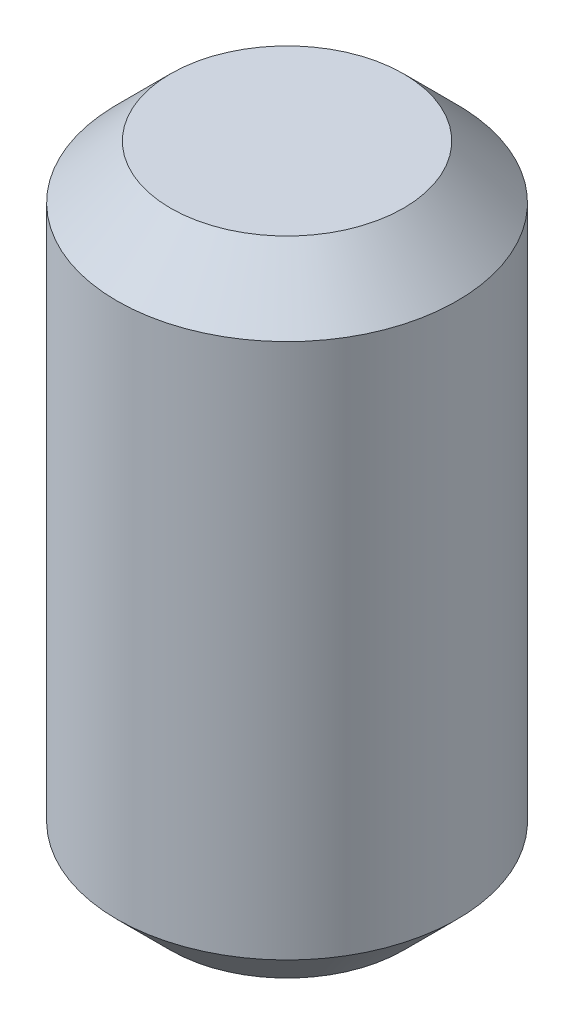
ISO-10303-21;
HEADER;
FILE_DESCRIPTION(('STEP AP214'),'2;1');
FILE_NAME('part.step','',(''),(''),'','','');
FILE_SCHEMA(('AUTOMOTIVE_DESIGN { 1 0 10303 214 1 1 1 1 }'));
ENDSEC;
DATA;
#1=APPLICATION_CONTEXT('core data for automotive mechanical design processes');
#2=APPLICATION_PROTOCOL_DEFINITION('international standard','automotive_design',2000,#1);
#3=PRODUCT_CONTEXT('',#1,'mechanical');
#4=PRODUCT('Part','Part','',(#3));
#5=PRODUCT_RELATED_PRODUCT_CATEGORY('part','',(#4));
#6=PRODUCT_DEFINITION_FORMATION('','',#4);
#7=PRODUCT_DEFINITION_CONTEXT('part definition',#1,'design');
#8=PRODUCT_DEFINITION('design','',#6,#7);
#9=PRODUCT_DEFINITION_SHAPE('','',#8);
#10=(LENGTH_UNIT() NAMED_UNIT(*) SI_UNIT(.MILLI.,.METRE.));
#11=(NAMED_UNIT(*) PLANE_ANGLE_UNIT() SI_UNIT($,.RADIAN.));
#12=(NAMED_UNIT(*) SI_UNIT($,.STERADIAN.) SOLID_ANGLE_UNIT());
#13=UNCERTAINTY_MEASURE_WITH_UNIT(LENGTH_MEASURE(1.E-05),#10,'distance_accuracy_value','');
#14=(GEOMETRIC_REPRESENTATION_CONTEXT(3) GLOBAL_UNCERTAINTY_ASSIGNED_CONTEXT((#13)) GLOBAL_UNIT_ASSIGNED_CONTEXT((#10,
#11,#12)) REPRESENTATION_CONTEXT('',''));
#15=CARTESIAN_POINT('',(0.,0.,0.));
#16=DIRECTION('',(0.,0.,1.));
#17=DIRECTION('',(1.,0.,0.));
#18=AXIS2_PLACEMENT_3D('',#15,#16,#17);
#19=CARTESIAN_POINT('',(0.,6.,0.));
#20=DIRECTION('',(0.,-1.,0.));
#21=DIRECTION('',(0.,0.,-1.));
#22=AXIS2_PLACEMENT_3D('',#19,#20,#21);
#23=CYLINDRICAL_SURFACE('',#22,1.5875);
#24=CARTESIAN_POINT('',(0.,0.5,0.));
#25=DIRECTION('',(0.,1.,0.));
#26=DIRECTION('',(0.,0.,1.));
#27=AXIS2_PLACEMENT_3D('',#24,#25,#26);
#28=CIRCLE('',#27,1.5875);
#29=CARTESIAN_POINT('',(0.,0.5,1.5875));
#30=VERTEX_POINT('',#29);
#31=EDGE_CURVE('E48',#30,#30,#28,.T.);
#32=ORIENTED_EDGE('',*,*,#31,.T.);
#33=EDGE_LOOP('',(#32));
#34=FACE_BOUND('',#33,.T.);
#35=CARTESIAN_POINT('',(0.,5.5,0.));
#36=DIRECTION('',(0.,1.,0.));
#37=DIRECTION('',(0.,0.,1.));
#38=AXIS2_PLACEMENT_3D('',#35,#36,#37);
#39=CIRCLE('',#38,1.5875);
#40=CARTESIAN_POINT('',(0.,5.5,1.5875));
#41=VERTEX_POINT('',#40);
#42=EDGE_CURVE('E52',#41,#41,#39,.F.);
#43=ORIENTED_EDGE('',*,*,#42,.T.);
#44=EDGE_LOOP('',(#43));
#45=FACE_BOUND('',#44,.T.);
#46=ADVANCED_FACE('F36',(#34,#45),#23,.T.);
#47=CARTESIAN_POINT('',(0.,6.,0.));
#48=DIRECTION('',(0.,1.,0.));
#49=DIRECTION('',(0.,0.,1.));
#50=AXIS2_PLACEMENT_3D('',#47,#48,#49);
#51=PLANE('',#50);
#52=CARTESIAN_POINT('',(0.,6.,0.));
#53=DIRECTION('',(0.,1.,0.));
#54=DIRECTION('',(0.,0.,1.));
#55=AXIS2_PLACEMENT_3D('',#52,#53,#54);
#56=CIRCLE('',#55,1.0875);
#57=CARTESIAN_POINT('',(0.,6.,1.0875));
#58=VERTEX_POINT('',#57);
#59=EDGE_CURVE('E10',#58,#58,#56,.T.);
#60=ORIENTED_EDGE('',*,*,#59,.T.);
#61=EDGE_LOOP('',(#60));
#62=FACE_BOUND('',#61,.T.);
#63=ADVANCED_FACE('F68',(#62),#51,.T.);
#64=CARTESIAN_POINT('',(0.,0.,0.));
#65=DIRECTION('',(0.,1.,0.));
#66=DIRECTION('',(0.,0.,1.));
#67=AXIS2_PLACEMENT_3D('',#64,#65,#66);
#68=PLANE('',#67);
#69=CARTESIAN_POINT('',(0.,0.,0.));
#70=DIRECTION('',(0.,1.,0.));
#71=DIRECTION('',(0.,0.,1.));
#72=AXIS2_PLACEMENT_3D('',#69,#70,#71);
#73=CIRCLE('',#72,1.0875);
#74=CARTESIAN_POINT('',(0.,0.,1.0875));
#75=VERTEX_POINT('',#74);
#76=EDGE_CURVE('E44',#75,#75,#73,.F.);
#77=ORIENTED_EDGE('',*,*,#76,.T.);
#78=EDGE_LOOP('',(#77));
#79=FACE_BOUND('',#78,.T.);
#80=ADVANCED_FACE('F65',(#79),#68,.F.);
#81=CARTESIAN_POINT('',(0.,0.5,0.));
#82=DIRECTION('',(0.,1.,0.));
#83=DIRECTION('',(0.,0.,1.));
#84=AXIS2_PLACEMENT_3D('',#81,#82,#83);
#85=CONICAL_SURFACE('',#84,1.5875,0.78539816339745);
#86=ORIENTED_EDGE('',*,*,#76,.F.);
#87=EDGE_LOOP('',(#86));
#88=FACE_BOUND('',#87,.T.);
#89=ORIENTED_EDGE('',*,*,#31,.F.);
#90=EDGE_LOOP('',(#89));
#91=FACE_BOUND('',#90,.T.);
#92=ADVANCED_FACE('F61',(#88,#91),#85,.T.);
#93=CARTESIAN_POINT('',(0.,6.,0.));
#94=DIRECTION('',(0.,-1.,0.));
#95=DIRECTION('',(0.,0.,-1.));
#96=AXIS2_PLACEMENT_3D('',#93,#94,#95);
#97=CONICAL_SURFACE('',#96,1.0875,0.785398163397445);
#98=ORIENTED_EDGE('',*,*,#42,.F.);
#99=EDGE_LOOP('',(#98));
#100=FACE_BOUND('',#99,.T.);
#101=ORIENTED_EDGE('',*,*,#59,.F.);
#102=EDGE_LOOP('',(#101));
#103=FACE_BOUND('',#102,.T.);
#104=ADVANCED_FACE('F39',(#100,#103),#97,.T.);
#105=CLOSED_SHELL('',(#46,#63,#80,#92,#104));
#106=MANIFOLD_SOLID_BREP('B2',#105);
#107=ADVANCED_BREP_SHAPE_REPRESENTATION('',(#18,#106),#14);
#108=SHAPE_DEFINITION_REPRESENTATION(#9,#107);
ENDSEC;
END-ISO-10303-21;
